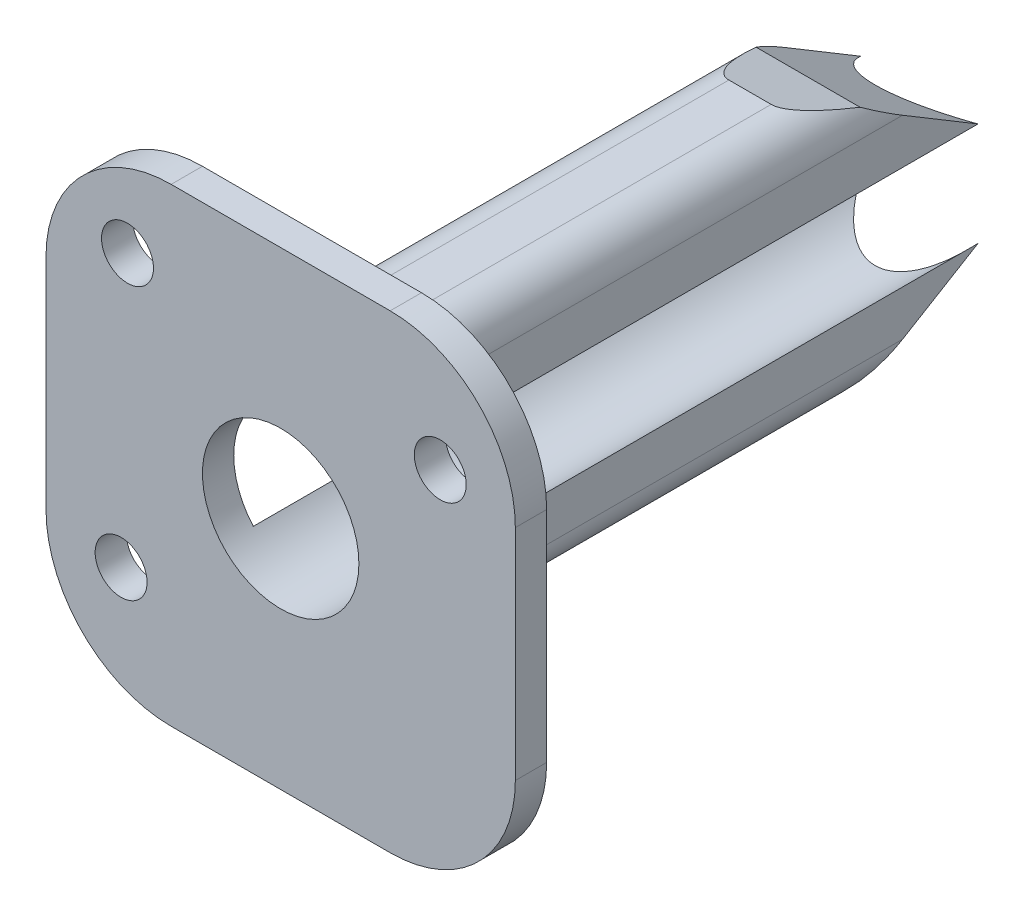
ISO-10303-21;
HEADER;
FILE_DESCRIPTION(('STEP AP214'),'2;1');
FILE_NAME('part.step','',(''),(''),'','','');
FILE_SCHEMA(('AUTOMOTIVE_DESIGN { 1 0 10303 214 1 1 1 1 }'));
ENDSEC;
DATA;
#1=APPLICATION_CONTEXT('core data for automotive mechanical design processes');
#2=APPLICATION_PROTOCOL_DEFINITION('international standard','automotive_design',2000,#1);
#3=PRODUCT_CONTEXT('',#1,'mechanical');
#4=PRODUCT('Part','Part','',(#3));
#5=PRODUCT_RELATED_PRODUCT_CATEGORY('part','',(#4));
#6=PRODUCT_DEFINITION_FORMATION('','',#4);
#7=PRODUCT_DEFINITION_CONTEXT('part definition',#1,'design');
#8=PRODUCT_DEFINITION('design','',#6,#7);
#9=PRODUCT_DEFINITION_SHAPE('','',#8);
#10=(LENGTH_UNIT() NAMED_UNIT(*) SI_UNIT(.MILLI.,.METRE.));
#11=(NAMED_UNIT(*) PLANE_ANGLE_UNIT() SI_UNIT($,.RADIAN.));
#12=(NAMED_UNIT(*) SI_UNIT($,.STERADIAN.) SOLID_ANGLE_UNIT());
#13=UNCERTAINTY_MEASURE_WITH_UNIT(LENGTH_MEASURE(1.E-05),#10,'distance_accuracy_value','');
#14=(GEOMETRIC_REPRESENTATION_CONTEXT(3) GLOBAL_UNCERTAINTY_ASSIGNED_CONTEXT((#13)) GLOBAL_UNIT_ASSIGNED_CONTEXT((#10,
#11,#12)) REPRESENTATION_CONTEXT('',''));
#15=CARTESIAN_POINT('',(0.,0.,0.));
#16=DIRECTION('',(0.,0.,1.));
#17=DIRECTION('',(1.,0.,0.));
#18=AXIS2_PLACEMENT_3D('',#15,#16,#17);
#19=CARTESIAN_POINT('',(0.,0.,0.));
#20=DIRECTION('',(0.,0.,1.));
#21=DIRECTION('',(1.,0.,0.));
#22=AXIS2_PLACEMENT_3D('',#19,#20,#21);
#23=PLANE('',#22);
#24=CARTESIAN_POINT('',(25.5,19.5,0.));
#25=DIRECTION('',(0.,0.,1.));
#26=DIRECTION('',(1.,0.,0.));
#27=AXIS2_PLACEMENT_3D('',#24,#25,#26);
#28=CIRCLE('',#27,4.15);
#29=CARTESIAN_POINT('',(29.65,19.5,0.));
#30=VERTEX_POINT('',#29);
#31=EDGE_CURVE('E213',#30,#30,#28,.T.);
#32=ORIENTED_EDGE('',*,*,#31,.T.);
#33=EDGE_LOOP('',(#32));
#34=FACE_BOUND('',#33,.T.);
#35=CARTESIAN_POINT('',(-24.48,24.48,0.));
#36=DIRECTION('',(0.,0.,1.));
#37=DIRECTION('',(1.,0.,0.));
#38=AXIS2_PLACEMENT_3D('',#35,#36,#37);
#39=CIRCLE('',#38,4.15);
#40=CARTESIAN_POINT('',(-20.33,24.48,0.));
#41=VERTEX_POINT('',#40);
#42=EDGE_CURVE('E444',#41,#41,#39,.T.);
#43=ORIENTED_EDGE('',*,*,#42,.T.);
#44=EDGE_LOOP('',(#43));
#45=FACE_BOUND('',#44,.T.);
#46=CARTESIAN_POINT('',(-25.5,-19.5,0.));
#47=DIRECTION('',(0.,0.,1.));
#48=DIRECTION('',(1.,0.,0.));
#49=AXIS2_PLACEMENT_3D('',#46,#47,#48);
#50=CIRCLE('',#49,4.15);
#51=CARTESIAN_POINT('',(-21.35,-19.5,0.));
#52=VERTEX_POINT('',#51);
#53=EDGE_CURVE('E448',#52,#52,#50,.T.);
#54=ORIENTED_EDGE('',*,*,#53,.T.);
#55=EDGE_LOOP('',(#54));
#56=FACE_BOUND('',#55,.T.);
#57=CARTESIAN_POINT('',(0.,0.,0.));
#58=DIRECTION('',(0.,0.,1.));
#59=DIRECTION('',(1.,0.,0.));
#60=AXIS2_PLACEMENT_3D('',#57,#58,#59);
#61=CIRCLE('',#60,12.5);
#62=CARTESIAN_POINT('',(-9.375,8.26797284707684,0.));
#63=VERTEX_POINT('',#62);
#64=CARTESIAN_POINT('',(-9.375,-8.26797284707685,0.));
#65=VERTEX_POINT('',#64);
#66=EDGE_CURVE('E212',#63,#65,#61,.T.);
#67=ORIENTED_EDGE('',*,*,#66,.T.);
#68=DIRECTION('',(0.,1.,0.));
#69=VECTOR('',#68,1.);
#70=CARTESIAN_POINT('',(-9.375,0.,0.));
#71=LINE('',#70,#69);
#72=CARTESIAN_POINT('',(-9.375,-15.5,0.));
#73=VERTEX_POINT('',#72);
#74=EDGE_CURVE('E252',#73,#65,#71,.T.);
#75=ORIENTED_EDGE('',*,*,#74,.F.);
#76=CARTESIAN_POINT('',(-3.375,-15.5,0.));
#77=DIRECTION('',(0.,0.,1.));
#78=DIRECTION('',(1.,0.,0.));
#79=AXIS2_PLACEMENT_3D('',#76,#77,#78);
#80=CIRCLE('',#79,6.);
#81=CARTESIAN_POINT('',(-3.375,-21.5,0.));
#82=VERTEX_POINT('',#81);
#83=EDGE_CURVE('E376',#73,#82,#80,.T.);
#84=ORIENTED_EDGE('',*,*,#83,.T.);
#85=DIRECTION('',(-1.,0.,0.));
#86=VECTOR('',#85,1.);
#87=CARTESIAN_POINT('',(0.,-21.5,0.));
#88=LINE('',#87,#86);
#89=CARTESIAN_POINT('',(3.375,-21.5,0.));
#90=VERTEX_POINT('',#89);
#91=EDGE_CURVE('E431',#90,#82,#88,.T.);
#92=ORIENTED_EDGE('',*,*,#91,.F.);
#93=CARTESIAN_POINT('',(3.375,-15.5,0.));
#94=DIRECTION('',(0.,0.,1.));
#95=DIRECTION('',(1.,0.,0.));
#96=AXIS2_PLACEMENT_3D('',#93,#94,#95);
#97=CIRCLE('',#96,6.);
#98=CARTESIAN_POINT('',(9.375,-15.5,0.));
#99=VERTEX_POINT('',#98);
#100=EDGE_CURVE('E379',#90,#99,#97,.T.);
#101=ORIENTED_EDGE('',*,*,#100,.T.);
#102=DIRECTION('',(0.,1.,0.));
#103=VECTOR('',#102,1.);
#104=CARTESIAN_POINT('',(9.375,0.,0.));
#105=LINE('',#104,#103);
#106=CARTESIAN_POINT('',(9.375,-8.26797284707684,0.));
#107=VERTEX_POINT('',#106);
#108=EDGE_CURVE('E207',#99,#107,#105,.T.);
#109=ORIENTED_EDGE('',*,*,#108,.T.);
#110=CARTESIAN_POINT('',(9.375,8.26797284707684,0.));
#111=VERTEX_POINT('',#110);
#112=EDGE_CURVE('E200',#107,#111,#61,.T.);
#113=ORIENTED_EDGE('',*,*,#112,.T.);
#114=DIRECTION('',(0.,1.,0.));
#115=VECTOR('',#114,1.);
#116=CARTESIAN_POINT('',(9.375,0.,0.));
#117=LINE('',#116,#115);
#118=CARTESIAN_POINT('',(9.375,15.5,0.));
#119=VERTEX_POINT('',#118);
#120=EDGE_CURVE('E205',#111,#119,#117,.T.);
#121=ORIENTED_EDGE('',*,*,#120,.T.);
#122=CARTESIAN_POINT('',(3.375,15.5,0.));
#123=DIRECTION('',(0.,0.,1.));
#124=DIRECTION('',(1.,0.,0.));
#125=AXIS2_PLACEMENT_3D('',#122,#123,#124);
#126=CIRCLE('',#125,6.);
#127=CARTESIAN_POINT('',(3.375,21.5,0.));
#128=VERTEX_POINT('',#127);
#129=EDGE_CURVE('E370',#119,#128,#126,.T.);
#130=ORIENTED_EDGE('',*,*,#129,.T.);
#131=DIRECTION('',(-1.,0.,0.));
#132=VECTOR('',#131,1.);
#133=CARTESIAN_POINT('',(0.,21.5,0.));
#134=LINE('',#133,#132);
#135=CARTESIAN_POINT('',(-3.375,21.5,0.));
#136=VERTEX_POINT('',#135);
#137=EDGE_CURVE('E234',#128,#136,#134,.T.);
#138=ORIENTED_EDGE('',*,*,#137,.T.);
#139=CARTESIAN_POINT('',(-3.375,15.5,0.));
#140=DIRECTION('',(0.,0.,1.));
#141=DIRECTION('',(1.,0.,0.));
#142=AXIS2_PLACEMENT_3D('',#139,#140,#141);
#143=CIRCLE('',#142,6.);
#144=CARTESIAN_POINT('',(-9.375,15.5,0.));
#145=VERTEX_POINT('',#144);
#146=EDGE_CURVE('E373',#136,#145,#143,.T.);
#147=ORIENTED_EDGE('',*,*,#146,.T.);
#148=DIRECTION('',(0.,1.,0.));
#149=VECTOR('',#148,1.);
#150=CARTESIAN_POINT('',(-9.375,0.,0.));
#151=LINE('',#150,#149);
#152=EDGE_CURVE('E227',#63,#145,#151,.T.);
#153=ORIENTED_EDGE('',*,*,#152,.F.);
#154=EDGE_LOOP('',(#67,#75,#84,#92,#101,#109,#113,#121,#130,#138,#147,#153));
#155=FACE_BOUND('',#154,.T.);
#156=DIRECTION('',(0.,1.,0.));
#157=VECTOR('',#156,1.);
#158=CARTESIAN_POINT('',(-37.5,0.,0.));
#159=LINE('',#158,#157);
#160=CARTESIAN_POINT('',(-37.5,-17.5,0.));
#161=VERTEX_POINT('',#160);
#162=CARTESIAN_POINT('',(-37.5,17.5,0.));
#163=VERTEX_POINT('',#162);
#164=EDGE_CURVE('E280',#161,#163,#159,.T.);
#165=ORIENTED_EDGE('',*,*,#164,.T.);
#166=CARTESIAN_POINT('',(-17.5,17.5,0.));
#167=DIRECTION('',(0.,0.,1.));
#168=DIRECTION('',(1.,0.,0.));
#169=AXIS2_PLACEMENT_3D('',#166,#167,#168);
#170=CIRCLE('',#169,20.);
#171=CARTESIAN_POINT('',(-17.5,37.5,0.));
#172=VERTEX_POINT('',#171);
#173=EDGE_CURVE('E398',#163,#172,#170,.F.);
#174=ORIENTED_EDGE('',*,*,#173,.T.);
#175=DIRECTION('',(-1.,0.,0.));
#176=VECTOR('',#175,1.);
#177=CARTESIAN_POINT('',(0.,37.5,0.));
#178=LINE('',#177,#176);
#179=CARTESIAN_POINT('',(17.5,37.5,0.));
#180=VERTEX_POINT('',#179);
#181=EDGE_CURVE('E275',#180,#172,#178,.T.);
#182=ORIENTED_EDGE('',*,*,#181,.F.);
#183=CARTESIAN_POINT('',(17.5,17.5,0.));
#184=DIRECTION('',(0.,0.,1.));
#185=DIRECTION('',(1.,0.,0.));
#186=AXIS2_PLACEMENT_3D('',#183,#184,#185);
#187=CIRCLE('',#186,20.);
#188=CARTESIAN_POINT('',(37.5,17.5,0.));
#189=VERTEX_POINT('',#188);
#190=EDGE_CURVE('E395',#180,#189,#187,.F.);
#191=ORIENTED_EDGE('',*,*,#190,.T.);
#192=DIRECTION('',(0.,1.,0.));
#193=VECTOR('',#192,1.);
#194=CARTESIAN_POINT('',(37.5,0.,0.));
#195=LINE('',#194,#193);
#196=CARTESIAN_POINT('',(37.5,-17.5,0.));
#197=VERTEX_POINT('',#196);
#198=EDGE_CURVE('E271',#197,#189,#195,.T.);
#199=ORIENTED_EDGE('',*,*,#198,.F.);
#200=CARTESIAN_POINT('',(17.5,-17.5,0.));
#201=DIRECTION('',(0.,0.,1.));
#202=DIRECTION('',(1.,0.,0.));
#203=AXIS2_PLACEMENT_3D('',#200,#201,#202);
#204=CIRCLE('',#203,20.);
#205=CARTESIAN_POINT('',(17.5,-37.5,0.));
#206=VERTEX_POINT('',#205);
#207=EDGE_CURVE('E389',#197,#206,#204,.F.);
#208=ORIENTED_EDGE('',*,*,#207,.T.);
#209=DIRECTION('',(-1.,0.,0.));
#210=VECTOR('',#209,1.);
#211=CARTESIAN_POINT('',(0.,-37.5,0.));
#212=LINE('',#211,#210);
#213=CARTESIAN_POINT('',(-17.5,-37.5,0.));
#214=VERTEX_POINT('',#213);
#215=EDGE_CURVE('E259',#206,#214,#212,.T.);
#216=ORIENTED_EDGE('',*,*,#215,.T.);
#217=CARTESIAN_POINT('',(-17.5,-17.5,0.));
#218=DIRECTION('',(0.,0.,1.));
#219=DIRECTION('',(1.,0.,0.));
#220=AXIS2_PLACEMENT_3D('',#217,#218,#219);
#221=CIRCLE('',#220,20.);
#222=EDGE_CURVE('E392',#214,#161,#221,.F.);
#223=ORIENTED_EDGE('',*,*,#222,.T.);
#224=EDGE_LOOP('',(#165,#174,#182,#191,#199,#208,#216,#223));
#225=FACE_BOUND('',#224,.T.);
#226=ADVANCED_FACE('F49',(#34,#45,#56,#155,#225),#23,.F.);
#227=CARTESIAN_POINT('',(37.5,0.,5.));
#228=DIRECTION('',(-1.,0.,0.));
#229=DIRECTION('',(0.,-1.,0.));
#230=AXIS2_PLACEMENT_3D('',#227,#228,#229);
#231=PLANE('',#230);
#232=ORIENTED_EDGE('',*,*,#198,.T.);
#233=DIRECTION('',(0.,0.,-1.));
#234=VECTOR('',#233,1.);
#235=CARTESIAN_POINT('',(37.5,17.5,5.));
#236=LINE('',#235,#234);
#237=CARTESIAN_POINT('',(37.5,17.5,5.));
#238=VERTEX_POINT('',#237);
#239=EDGE_CURVE('E423',#189,#238,#236,.F.);
#240=ORIENTED_EDGE('',*,*,#239,.T.);
#241=DIRECTION('',(0.,1.,0.));
#242=VECTOR('',#241,1.);
#243=CARTESIAN_POINT('',(37.5,0.,5.));
#244=LINE('',#243,#242);
#245=CARTESIAN_POINT('',(37.5,-17.5,5.));
#246=VERTEX_POINT('',#245);
#247=EDGE_CURVE('E254',#246,#238,#244,.T.);
#248=ORIENTED_EDGE('',*,*,#247,.F.);
#249=DIRECTION('',(0.,0.,-1.));
#250=VECTOR('',#249,1.);
#251=CARTESIAN_POINT('',(37.5,-17.5,0.));
#252=LINE('',#251,#250);
#253=EDGE_CURVE('E419',#246,#197,#252,.T.);
#254=ORIENTED_EDGE('',*,*,#253,.T.);
#255=EDGE_LOOP('',(#232,#240,#248,#254));
#256=FACE_BOUND('',#255,.T.);
#257=ADVANCED_FACE('F502',(#256),#231,.F.);
#258=CARTESIAN_POINT('',(0.,37.5,5.));
#259=DIRECTION('',(0.,-1.,0.));
#260=DIRECTION('',(0.,0.,-1.));
#261=AXIS2_PLACEMENT_3D('',#258,#259,#260);
#262=PLANE('',#261);
#263=ORIENTED_EDGE('',*,*,#181,.T.);
#264=DIRECTION('',(0.,0.,-1.));
#265=VECTOR('',#264,1.);
#266=CARTESIAN_POINT('',(-17.5,37.5,5.));
#267=LINE('',#266,#265);
#268=CARTESIAN_POINT('',(-17.5,37.5,5.));
#269=VERTEX_POINT('',#268);
#270=EDGE_CURVE('E405',#172,#269,#267,.F.);
#271=ORIENTED_EDGE('',*,*,#270,.T.);
#272=DIRECTION('',(-1.,0.,0.));
#273=VECTOR('',#272,1.);
#274=CARTESIAN_POINT('',(0.,37.5,5.));
#275=LINE('',#274,#273);
#276=CARTESIAN_POINT('',(17.5,37.5,5.));
#277=VERTEX_POINT('',#276);
#278=EDGE_CURVE('E258',#277,#269,#275,.T.);
#279=ORIENTED_EDGE('',*,*,#278,.F.);
#280=DIRECTION('',(0.,0.,-1.));
#281=VECTOR('',#280,1.);
#282=CARTESIAN_POINT('',(17.5,37.5,5.));
#283=LINE('',#282,#281);
#284=EDGE_CURVE('E401',#277,#180,#283,.T.);
#285=ORIENTED_EDGE('',*,*,#284,.T.);
#286=EDGE_LOOP('',(#263,#271,#279,#285));
#287=FACE_BOUND('',#286,.T.);
#288=ADVANCED_FACE('F506',(#287),#262,.F.);
#289=CARTESIAN_POINT('',(-37.5,0.,5.));
#290=DIRECTION('',(-1.,0.,0.));
#291=DIRECTION('',(0.,-1.,0.));
#292=AXIS2_PLACEMENT_3D('',#289,#290,#291);
#293=PLANE('',#292);
#294=DIRECTION('',(0.,1.,0.));
#295=VECTOR('',#294,1.);
#296=CARTESIAN_POINT('',(-37.5,0.,5.));
#297=LINE('',#296,#295);
#298=CARTESIAN_POINT('',(-37.5,-17.5,5.));
#299=VERTEX_POINT('',#298);
#300=CARTESIAN_POINT('',(-37.5,17.5,5.));
#301=VERTEX_POINT('',#300);
#302=EDGE_CURVE('E263',#299,#301,#297,.T.);
#303=ORIENTED_EDGE('',*,*,#302,.T.);
#304=DIRECTION('',(0.,0.,-1.));
#305=VECTOR('',#304,1.);
#306=CARTESIAN_POINT('',(-37.5,17.5,0.));
#307=LINE('',#306,#305);
#308=EDGE_CURVE('E385',#301,#163,#307,.T.);
#309=ORIENTED_EDGE('',*,*,#308,.T.);
#310=ORIENTED_EDGE('',*,*,#164,.F.);
#311=DIRECTION('',(0.,0.,-1.));
#312=VECTOR('',#311,1.);
#313=CARTESIAN_POINT('',(-37.5,-17.5,5.));
#314=LINE('',#313,#312);
#315=EDGE_CURVE('E382',#161,#299,#314,.F.);
#316=ORIENTED_EDGE('',*,*,#315,.T.);
#317=EDGE_LOOP('',(#303,#309,#310,#316));
#318=FACE_BOUND('',#317,.T.);
#319=ADVANCED_FACE('F490',(#318),#293,.T.);
#320=CARTESIAN_POINT('',(0.,-37.5,5.));
#321=DIRECTION('',(0.,-1.,0.));
#322=DIRECTION('',(1.,0.,0.));
#323=AXIS2_PLACEMENT_3D('',#320,#321,#322);
#324=PLANE('',#323);
#325=DIRECTION('',(-1.,0.,0.));
#326=VECTOR('',#325,1.);
#327=CARTESIAN_POINT('',(0.,-37.5,5.));
#328=LINE('',#327,#326);
#329=CARTESIAN_POINT('',(17.5,-37.5,5.));
#330=VERTEX_POINT('',#329);
#331=CARTESIAN_POINT('',(-17.5,-37.5,5.));
#332=VERTEX_POINT('',#331);
#333=EDGE_CURVE('E267',#330,#332,#328,.T.);
#334=ORIENTED_EDGE('',*,*,#333,.T.);
#335=DIRECTION('',(0.,0.,-1.));
#336=VECTOR('',#335,1.);
#337=CARTESIAN_POINT('',(-17.5,-37.5,5.));
#338=LINE('',#337,#336);
#339=EDGE_CURVE('E11',#332,#214,#338,.T.);
#340=ORIENTED_EDGE('',*,*,#339,.T.);
#341=ORIENTED_EDGE('',*,*,#215,.F.);
#342=DIRECTION('',(0.,0.,-1.));
#343=VECTOR('',#342,1.);
#344=CARTESIAN_POINT('',(17.5,-37.5,5.));
#345=LINE('',#344,#343);
#346=EDGE_CURVE('E58',#206,#330,#345,.F.);
#347=ORIENTED_EDGE('',*,*,#346,.T.);
#348=EDGE_LOOP('',(#334,#340,#341,#347));
#349=FACE_BOUND('',#348,.T.);
#350=ADVANCED_FACE('F472',(#349),#324,.T.);
#351=CARTESIAN_POINT('',(0.,0.,5.));
#352=DIRECTION('',(0.,0.,1.));
#353=DIRECTION('',(1.,0.,0.));
#354=AXIS2_PLACEMENT_3D('',#351,#352,#353);
#355=PLANE('',#354);
#356=CARTESIAN_POINT('',(25.5,19.5,5.));
#357=DIRECTION('',(0.,0.,1.));
#358=DIRECTION('',(1.,0.,0.));
#359=AXIS2_PLACEMENT_3D('',#356,#357,#358);
#360=CIRCLE('',#359,4.15);
#361=CARTESIAN_POINT('',(29.65,19.5,5.));
#362=VERTEX_POINT('',#361);
#363=EDGE_CURVE('E452',#362,#362,#360,.T.);
#364=ORIENTED_EDGE('',*,*,#363,.F.);
#365=EDGE_LOOP('',(#364));
#366=FACE_BOUND('',#365,.T.);
#367=CARTESIAN_POINT('',(-24.48,24.48,5.));
#368=DIRECTION('',(0.,0.,1.));
#369=DIRECTION('',(1.,0.,0.));
#370=AXIS2_PLACEMENT_3D('',#367,#368,#369);
#371=CIRCLE('',#370,4.15);
#372=CARTESIAN_POINT('',(-20.33,24.48,5.));
#373=VERTEX_POINT('',#372);
#374=EDGE_CURVE('E457',#373,#373,#371,.T.);
#375=ORIENTED_EDGE('',*,*,#374,.F.);
#376=EDGE_LOOP('',(#375));
#377=FACE_BOUND('',#376,.T.);
#378=CARTESIAN_POINT('',(-25.5,-19.5,5.));
#379=DIRECTION('',(0.,0.,1.));
#380=DIRECTION('',(1.,0.,0.));
#381=AXIS2_PLACEMENT_3D('',#378,#379,#380);
#382=CIRCLE('',#381,4.15);
#383=CARTESIAN_POINT('',(-21.35,-19.5,5.));
#384=VERTEX_POINT('',#383);
#385=EDGE_CURVE('E453',#384,#384,#382,.T.);
#386=ORIENTED_EDGE('',*,*,#385,.F.);
#387=EDGE_LOOP('',(#386));
#388=FACE_BOUND('',#387,.T.);
#389=CARTESIAN_POINT('',(0.,0.,5.));
#390=DIRECTION('',(0.,0.,1.));
#391=DIRECTION('',(1.,0.,0.));
#392=AXIS2_PLACEMENT_3D('',#389,#390,#391);
#393=CIRCLE('',#392,12.5);
#394=CARTESIAN_POINT('',(12.5,0.,5.));
#395=VERTEX_POINT('',#394);
#396=EDGE_CURVE('E235',#395,#395,#393,.T.);
#397=ORIENTED_EDGE('',*,*,#396,.F.);
#398=EDGE_LOOP('',(#397));
#399=FACE_BOUND('',#398,.T.);
#400=ORIENTED_EDGE('',*,*,#278,.T.);
#401=CARTESIAN_POINT('',(-17.5,17.5,5.));
#402=DIRECTION('',(0.,0.,1.));
#403=DIRECTION('',(1.,0.,0.));
#404=AXIS2_PLACEMENT_3D('',#401,#402,#403);
#405=CIRCLE('',#404,20.);
#406=EDGE_CURVE('E416',#269,#301,#405,.T.);
#407=ORIENTED_EDGE('',*,*,#406,.T.);
#408=ORIENTED_EDGE('',*,*,#302,.F.);
#409=CARTESIAN_POINT('',(-17.5,-17.5,5.));
#410=DIRECTION('',(0.,0.,1.));
#411=DIRECTION('',(1.,0.,0.));
#412=AXIS2_PLACEMENT_3D('',#409,#410,#411);
#413=CIRCLE('',#412,20.);
#414=EDGE_CURVE('E65',#299,#332,#413,.T.);
#415=ORIENTED_EDGE('',*,*,#414,.T.);
#416=ORIENTED_EDGE('',*,*,#333,.F.);
#417=CARTESIAN_POINT('',(17.5,-17.5,5.));
#418=DIRECTION('',(0.,0.,1.));
#419=DIRECTION('',(1.,0.,0.));
#420=AXIS2_PLACEMENT_3D('',#417,#418,#419);
#421=CIRCLE('',#420,20.);
#422=EDGE_CURVE('E408',#330,#246,#421,.T.);
#423=ORIENTED_EDGE('',*,*,#422,.T.);
#424=ORIENTED_EDGE('',*,*,#247,.T.);
#425=CARTESIAN_POINT('',(17.5,17.5,5.));
#426=DIRECTION('',(0.,0.,1.));
#427=DIRECTION('',(1.,0.,0.));
#428=AXIS2_PLACEMENT_3D('',#425,#426,#427);
#429=CIRCLE('',#428,20.);
#430=EDGE_CURVE('E413',#238,#277,#429,.T.);
#431=ORIENTED_EDGE('',*,*,#430,.T.);
#432=EDGE_LOOP('',(#400,#407,#408,#415,#416,#423,#424,#431));
#433=FACE_BOUND('',#432,.T.);
#434=ADVANCED_FACE('F468',(#366,#377,#388,#399,#433),#355,.T.);
#435=CARTESIAN_POINT('',(-9.375,0.,-100.));
#436=DIRECTION('',(1.,0.,0.));
#437=DIRECTION('',(0.,1.,0.));
#438=AXIS2_PLACEMENT_3D('',#435,#436,#437);
#439=PLANE('',#438);
#440=ORIENTED_EDGE('',*,*,#152,.T.);
#441=DIRECTION('',(0.,0.,1.));
#442=VECTOR('',#441,1.);
#443=CARTESIAN_POINT('',(-9.375,15.5,-69.9999999999998));
#444=LINE('',#443,#442);
#445=CARTESIAN_POINT('',(-9.375,15.5,-84.9999999999998));
#446=VERTEX_POINT('',#445);
#447=EDGE_CURVE('E341',#145,#446,#444,.F.);
#448=ORIENTED_EDGE('',*,*,#447,.T.);
#449=DIRECTION('',(0.,-0.514495755427529,-0.857492925712543));
#450=VECTOR('',#449,1.);
#451=CARTESIAN_POINT('',(-9.37500000000001,21.5,-74.9999999999999));
#452=LINE('',#451,#450);
#453=CARTESIAN_POINT('',(-9.375,8.26797284707684,-97.053378588205));
#454=VERTEX_POINT('',#453);
#455=EDGE_CURVE('E270',#446,#454,#452,.T.);
#456=ORIENTED_EDGE('',*,*,#455,.T.);
#457=DIRECTION('',(0.,0.,1.));
#458=VECTOR('',#457,1.);
#459=CARTESIAN_POINT('',(-9.375,8.26797284707684,-100.));
#460=LINE('',#459,#458);
#461=EDGE_CURVE('E226',#454,#63,#460,.T.);
#462=ORIENTED_EDGE('',*,*,#461,.T.);
#463=EDGE_LOOP('',(#440,#448,#456,#462));
#464=FACE_BOUND('',#463,.T.);
#465=ADVANCED_FACE('F471',(#464),#439,.F.);
#466=CARTESIAN_POINT('',(0.,21.5,-100.));
#467=DIRECTION('',(0.,1.,0.));
#468=DIRECTION('',(0.,0.,1.));
#469=AXIS2_PLACEMENT_3D('',#466,#467,#468);
#470=PLANE('',#469);
#471=ORIENTED_EDGE('',*,*,#137,.F.);
#472=DIRECTION('',(0.,0.,1.));
#473=VECTOR('',#472,1.);
#474=CARTESIAN_POINT('',(3.375,21.5,-100.));
#475=LINE('',#474,#473);
#476=CARTESIAN_POINT('',(3.375,21.5,-69.9999999999998));
#477=VERTEX_POINT('',#476);
#478=EDGE_CURVE('E326',#128,#477,#475,.F.);
#479=ORIENTED_EDGE('',*,*,#478,.T.);
#480=DIRECTION('',(-1.,0.,0.));
#481=VECTOR('',#480,1.);
#482=CARTESIAN_POINT('',(0.,21.5,-69.9999999999998));
#483=LINE('',#482,#481);
#484=CARTESIAN_POINT('',(-3.375,21.5,-69.9999999999998));
#485=VERTEX_POINT('',#484);
#486=EDGE_CURVE('E304',#477,#485,#483,.T.);
#487=ORIENTED_EDGE('',*,*,#486,.T.);
#488=DIRECTION('',(0.,0.,1.));
#489=VECTOR('',#488,1.);
#490=CARTESIAN_POINT('',(-3.375,21.5,0.));
#491=LINE('',#490,#489);
#492=EDGE_CURVE('E322',#485,#136,#491,.T.);
#493=ORIENTED_EDGE('',*,*,#492,.T.);
#494=EDGE_LOOP('',(#471,#479,#487,#493));
#495=FACE_BOUND('',#494,.T.);
#496=ADVANCED_FACE('F606',(#495),#470,.T.);
#497=CARTESIAN_POINT('',(9.375,0.,-100.));
#498=DIRECTION('',(1.,0.,0.));
#499=DIRECTION('',(0.,1.,0.));
#500=AXIS2_PLACEMENT_3D('',#497,#498,#499);
#501=PLANE('',#500);
#502=DIRECTION('',(0.,0.514495755427529,0.857492925712543));
#503=VECTOR('',#502,1.);
#504=CARTESIAN_POINT('',(9.375,4.77941176470572,-102.867647058823));
#505=LINE('',#504,#503);
#506=CARTESIAN_POINT('',(9.375,8.26797284707684,-97.053378588205));
#507=VERTEX_POINT('',#506);
#508=CARTESIAN_POINT('',(9.375,15.5,-84.9999999999998));
#509=VERTEX_POINT('',#508);
#510=EDGE_CURVE('E291',#507,#509,#505,.T.);
#511=ORIENTED_EDGE('',*,*,#510,.T.);
#512=DIRECTION('',(0.,0.,1.));
#513=VECTOR('',#512,1.);
#514=CARTESIAN_POINT('',(9.375,15.5,-100.));
#515=LINE('',#514,#513);
#516=EDGE_CURVE('E232',#509,#119,#515,.T.);
#517=ORIENTED_EDGE('',*,*,#516,.T.);
#518=ORIENTED_EDGE('',*,*,#120,.F.);
#519=DIRECTION('',(0.,0.,1.));
#520=VECTOR('',#519,1.);
#521=CARTESIAN_POINT('',(9.375,8.26797284707684,-100.));
#522=LINE('',#521,#520);
#523=EDGE_CURVE('E216',#507,#111,#522,.T.);
#524=ORIENTED_EDGE('',*,*,#523,.F.);
#525=EDGE_LOOP('',(#511,#517,#518,#524));
#526=FACE_BOUND('',#525,.T.);
#527=ADVANCED_FACE('F230',(#526),#501,.T.);
#528=CARTESIAN_POINT('',(0.,0.,-100.));
#529=DIRECTION('',(0.,0.,1.));
#530=DIRECTION('',(1.,0.,0.));
#531=AXIS2_PLACEMENT_3D('',#528,#529,#530);
#532=CYLINDRICAL_SURFACE('',#531,12.5);
#533=DIRECTION('',(0.,0.,1.));
#534=VECTOR('',#533,1.);
#535=CARTESIAN_POINT('',(9.375,-8.26797284707684,-100.));
#536=LINE('',#535,#534);
#537=CARTESIAN_POINT('',(9.375,-8.26797284707684,-97.053378588205));
#538=VERTEX_POINT('',#537);
#539=EDGE_CURVE('E276',#538,#107,#536,.T.);
#540=ORIENTED_EDGE('',*,*,#539,.F.);
#541=CARTESIAN_POINT('',(0.,0.,-110.833333333333));
#542=DIRECTION('',(0.,0.857492925712542,0.514495755427529));
#543=DIRECTION('',(0.,-0.514495755427529,0.857492925712543));
#544=AXIS2_PLACEMENT_3D('',#541,#542,#543);
#545=ELLIPSE('',#544,24.2956328951886,12.5);
#546=CARTESIAN_POINT('',(-9.375,-8.26797284707685,-97.053378588205));
#547=VERTEX_POINT('',#546);
#548=EDGE_CURVE('E294',#538,#547,#545,.F.);
#549=ORIENTED_EDGE('',*,*,#548,.T.);
#550=DIRECTION('',(0.,0.,1.));
#551=VECTOR('',#550,1.);
#552=CARTESIAN_POINT('',(-9.375,-8.26797284707685,-100.));
#553=LINE('',#552,#551);
#554=EDGE_CURVE('E244',#547,#65,#553,.T.);
#555=ORIENTED_EDGE('',*,*,#554,.T.);
#556=ORIENTED_EDGE('',*,*,#66,.F.);
#557=ORIENTED_EDGE('',*,*,#461,.F.);
#558=CARTESIAN_POINT('',(0.,0.,-110.833333333333));
#559=DIRECTION('',(0.,0.857492925712542,-0.514495755427529));
#560=DIRECTION('',(0.,0.514495755427529,0.857492925712543));
#561=AXIS2_PLACEMENT_3D('',#558,#559,#560);
#562=ELLIPSE('',#561,24.2956328951886,12.5);
#563=EDGE_CURVE('E221',#454,#507,#562,.T.);
#564=ORIENTED_EDGE('',*,*,#563,.T.);
#565=ORIENTED_EDGE('',*,*,#523,.T.);
#566=ORIENTED_EDGE('',*,*,#112,.F.);
#567=EDGE_LOOP('',(#540,#549,#555,#556,#557,#564,#565,#566));
#568=FACE_BOUND('',#567,.T.);
#569=ORIENTED_EDGE('',*,*,#396,.T.);
#570=EDGE_LOOP('',(#569));
#571=FACE_BOUND('',#570,.T.);
#572=ADVANCED_FACE('F217',(#568,#571),#532,.F.);
#573=CARTESIAN_POINT('',(9.375,0.,-100.));
#574=DIRECTION('',(1.,0.,0.));
#575=DIRECTION('',(0.,1.,0.));
#576=AXIS2_PLACEMENT_3D('',#573,#574,#575);
#577=PLANE('',#576);
#578=ORIENTED_EDGE('',*,*,#108,.F.);
#579=DIRECTION('',(0.,0.,1.));
#580=VECTOR('',#579,1.);
#581=CARTESIAN_POINT('',(9.375,-15.5,-69.9999999999998));
#582=LINE('',#581,#580);
#583=CARTESIAN_POINT('',(9.375,-15.5,-84.9999999999998));
#584=VERTEX_POINT('',#583);
#585=EDGE_CURVE('E367',#99,#584,#582,.F.);
#586=ORIENTED_EDGE('',*,*,#585,.T.);
#587=DIRECTION('',(0.,-0.514495755427529,0.857492925712543));
#588=VECTOR('',#587,1.);
#589=CARTESIAN_POINT('',(9.375,-4.77941176470574,-102.867647058823));
#590=LINE('',#589,#588);
#591=EDGE_CURVE('E301',#584,#538,#590,.F.);
#592=ORIENTED_EDGE('',*,*,#591,.T.);
#593=ORIENTED_EDGE('',*,*,#539,.T.);
#594=EDGE_LOOP('',(#578,#586,#592,#593));
#595=FACE_BOUND('',#594,.T.);
#596=ADVANCED_FACE('F590',(#595),#577,.T.);
#597=CARTESIAN_POINT('',(0.,-21.5,-100.));
#598=DIRECTION('',(0.,1.,0.));
#599=DIRECTION('',(-1.,0.,0.));
#600=AXIS2_PLACEMENT_3D('',#597,#598,#599);
#601=PLANE('',#600);
#602=ORIENTED_EDGE('',*,*,#91,.T.);
#603=DIRECTION('',(0.,0.,1.));
#604=VECTOR('',#603,1.);
#605=CARTESIAN_POINT('',(-3.375,-21.5,-100.));
#606=LINE('',#605,#604);
#607=CARTESIAN_POINT('',(-3.375,-21.5,-69.9999999999998));
#608=VERTEX_POINT('',#607);
#609=EDGE_CURVE('E352',#82,#608,#606,.F.);
#610=ORIENTED_EDGE('',*,*,#609,.T.);
#611=DIRECTION('',(1.,0.,0.));
#612=VECTOR('',#611,1.);
#613=CARTESIAN_POINT('',(9.375,-21.5,-69.9999999999998));
#614=LINE('',#613,#612);
#615=CARTESIAN_POINT('',(3.375,-21.5,-69.9999999999998));
#616=VERTEX_POINT('',#615);
#617=EDGE_CURVE('E312',#608,#616,#614,.T.);
#618=ORIENTED_EDGE('',*,*,#617,.T.);
#619=DIRECTION('',(0.,0.,1.));
#620=VECTOR('',#619,1.);
#621=CARTESIAN_POINT('',(3.375,-21.5,0.));
#622=LINE('',#621,#620);
#623=EDGE_CURVE('E348',#616,#90,#622,.T.);
#624=ORIENTED_EDGE('',*,*,#623,.T.);
#625=EDGE_LOOP('',(#602,#610,#618,#624));
#626=FACE_BOUND('',#625,.T.);
#627=ADVANCED_FACE('F593',(#626),#601,.F.);
#628=CARTESIAN_POINT('',(-9.375,0.,-100.));
#629=DIRECTION('',(1.,0.,0.));
#630=DIRECTION('',(0.,1.,0.));
#631=AXIS2_PLACEMENT_3D('',#628,#629,#630);
#632=PLANE('',#631);
#633=DIRECTION('',(0.,0.514495755427529,-0.857492925712543));
#634=VECTOR('',#633,1.);
#635=CARTESIAN_POINT('',(-9.375,-6.49999999999984,-100.));
#636=LINE('',#635,#634);
#637=CARTESIAN_POINT('',(-9.375,-15.5,-84.9999999999998));
#638=VERTEX_POINT('',#637);
#639=EDGE_CURVE('E297',#547,#638,#636,.F.);
#640=ORIENTED_EDGE('',*,*,#639,.T.);
#641=DIRECTION('',(0.,0.,1.));
#642=VECTOR('',#641,1.);
#643=CARTESIAN_POINT('',(-9.375,-15.5,-100.));
#644=LINE('',#643,#642);
#645=EDGE_CURVE('E344',#638,#73,#644,.T.);
#646=ORIENTED_EDGE('',*,*,#645,.T.);
#647=ORIENTED_EDGE('',*,*,#74,.T.);
#648=ORIENTED_EDGE('',*,*,#554,.F.);
#649=EDGE_LOOP('',(#640,#646,#647,#648));
#650=FACE_BOUND('',#649,.T.);
#651=ADVANCED_FACE('F597',(#650),#632,.F.);
#652=CARTESIAN_POINT('',(0.,21.5,-74.9999999999999));
#653=DIRECTION('',(0.,0.857492925712542,-0.514495755427529));
#654=DIRECTION('',(1.,0.,0.));
#655=AXIS2_PLACEMENT_3D('',#652,#653,#654);
#656=PLANE('',#655);
#657=DIRECTION('',(1.,0.,0.));
#658=VECTOR('',#657,1.);
#659=CARTESIAN_POINT('',(0.,18.9275212228623,-79.2874646285627));
#660=LINE('',#659,#658);
#661=CARTESIAN_POINT('',(-8.29964194300748,18.9275212228623,-79.2874646285627));
#662=VERTEX_POINT('',#661);
#663=CARTESIAN_POINT('',(8.29964194300748,18.9275212228623,-79.2874646285627));
#664=VERTEX_POINT('',#663);
#665=EDGE_CURVE('E308',#662,#664,#660,.T.);
#666=ORIENTED_EDGE('',*,*,#665,.T.);
#667=CARTESIAN_POINT('',(3.375,15.5,-84.9999999999998));
#668=DIRECTION('',(0.,0.857492925712542,-0.514495755427529));
#669=DIRECTION('',(0.,0.514495755427529,0.857492925712543));
#670=AXIS2_PLACEMENT_3D('',#667,#668,#669);
#671=ELLIPSE('',#670,11.6619037896905,6.);
#672=EDGE_CURVE('E338',#664,#509,#671,.T.);
#673=ORIENTED_EDGE('',*,*,#672,.T.);
#674=ORIENTED_EDGE('',*,*,#510,.F.);
#675=ORIENTED_EDGE('',*,*,#563,.F.);
#676=ORIENTED_EDGE('',*,*,#455,.F.);
#677=CARTESIAN_POINT('',(-3.375,15.5,-84.9999999999998));
#678=DIRECTION('',(0.,0.857492925712542,-0.514495755427529));
#679=DIRECTION('',(0.,-0.514495755427529,-0.857492925712543));
#680=AXIS2_PLACEMENT_3D('',#677,#678,#679);
#681=ELLIPSE('',#680,11.6619037896905,6.);
#682=EDGE_CURVE('E335',#446,#662,#681,.T.);
#683=ORIENTED_EDGE('',*,*,#682,.T.);
#684=EDGE_LOOP('',(#666,#673,#674,#675,#676,#683));
#685=FACE_BOUND('',#684,.T.);
#686=ADVANCED_FACE('F601',(#685),#656,.T.);
#687=CARTESIAN_POINT('',(0.,-6.49999999999984,-100.));
#688=DIRECTION('',(0.,0.857492925712542,0.514495755427529));
#689=DIRECTION('',(-1.,0.,0.));
#690=AXIS2_PLACEMENT_3D('',#687,#688,#689);
#691=PLANE('',#690);
#692=DIRECTION('',(1.,0.,0.));
#693=VECTOR('',#692,1.);
#694=CARTESIAN_POINT('',(-9.375,-18.9275212228623,-79.2874646285627));
#695=LINE('',#694,#693);
#696=CARTESIAN_POINT('',(8.29964194300748,-18.9275212228623,-79.2874646285627));
#697=VERTEX_POINT('',#696);
#698=CARTESIAN_POINT('',(-8.29964194300748,-18.9275212228623,-79.2874646285627));
#699=VERTEX_POINT('',#698);
#700=EDGE_CURVE('E316',#697,#699,#695,.F.);
#701=ORIENTED_EDGE('',*,*,#700,.T.);
#702=CARTESIAN_POINT('',(-3.375,-15.5,-84.9999999999998));
#703=DIRECTION('',(0.,0.857492925712542,0.514495755427529));
#704=DIRECTION('',(0.,-0.514495755427529,0.857492925712543));
#705=AXIS2_PLACEMENT_3D('',#702,#703,#704);
#706=ELLIPSE('',#705,11.6619037896905,6.);
#707=EDGE_CURVE('E364',#699,#638,#706,.F.);
#708=ORIENTED_EDGE('',*,*,#707,.T.);
#709=ORIENTED_EDGE('',*,*,#639,.F.);
#710=ORIENTED_EDGE('',*,*,#548,.F.);
#711=ORIENTED_EDGE('',*,*,#591,.F.);
#712=CARTESIAN_POINT('',(3.375,-15.5,-84.9999999999998));
#713=DIRECTION('',(0.,0.857492925712542,0.514495755427529));
#714=DIRECTION('',(0.,0.514495755427529,-0.857492925712543));
#715=AXIS2_PLACEMENT_3D('',#712,#713,#714);
#716=ELLIPSE('',#715,11.6619037896905,6.);
#717=EDGE_CURVE('E361',#584,#697,#716,.F.);
#718=ORIENTED_EDGE('',*,*,#717,.T.);
#719=EDGE_LOOP('',(#701,#708,#709,#710,#711,#718));
#720=FACE_BOUND('',#719,.T.);
#721=ADVANCED_FACE('F638',(#720),#691,.F.);
#722=CARTESIAN_POINT('',(0.,21.5,-69.9999999999998));
#723=DIRECTION('',(0.,-0.96371492821076,0.266933581895814));
#724=DIRECTION('',(-1.,0.,0.));
#725=AXIS2_PLACEMENT_3D('',#722,#723,#724);
#726=PLANE('',#725);
#727=ORIENTED_EDGE('',*,*,#486,.F.);
#728=CARTESIAN_POINT('',(3.375,15.5,-91.6619037896902));
#729=DIRECTION('',(0.,-0.96371492821076,0.266933581895814));
#730=DIRECTION('',(0.,0.266933581895814,0.96371492821076));
#731=AXIS2_PLACEMENT_3D('',#728,#729,#730);
#732=ELLIPSE('',#731,22.4775015469648,6.);
#733=EDGE_CURVE('E332',#477,#664,#732,.F.);
#734=ORIENTED_EDGE('',*,*,#733,.T.);
#735=ORIENTED_EDGE('',*,*,#665,.F.);
#736=CARTESIAN_POINT('',(-3.375,15.5,-91.6619037896902));
#737=DIRECTION('',(0.,-0.96371492821076,0.266933581895814));
#738=DIRECTION('',(0.,-0.266933581895814,-0.96371492821076));
#739=AXIS2_PLACEMENT_3D('',#736,#737,#738);
#740=ELLIPSE('',#739,22.4775015469648,6.);
#741=EDGE_CURVE('E329',#662,#485,#740,.F.);
#742=ORIENTED_EDGE('',*,*,#741,.T.);
#743=EDGE_LOOP('',(#727,#734,#735,#742));
#744=FACE_BOUND('',#743,.T.);
#745=ADVANCED_FACE('F647',(#744),#726,.F.);
#746=CARTESIAN_POINT('',(0.,-21.5,-69.9999999999998));
#747=DIRECTION('',(0.,0.96371492821076,0.266933581895814));
#748=DIRECTION('',(1.,0.,0.));
#749=AXIS2_PLACEMENT_3D('',#746,#747,#748);
#750=PLANE('',#749);
#751=ORIENTED_EDGE('',*,*,#617,.F.);
#752=CARTESIAN_POINT('',(-3.375,-15.5,-91.6619037896902));
#753=DIRECTION('',(0.,0.96371492821076,0.266933581895814));
#754=DIRECTION('',(0.,-0.266933581895814,0.96371492821076));
#755=AXIS2_PLACEMENT_3D('',#752,#753,#754);
#756=ELLIPSE('',#755,22.4775015469648,6.);
#757=EDGE_CURVE('E358',#608,#699,#756,.F.);
#758=ORIENTED_EDGE('',*,*,#757,.T.);
#759=ORIENTED_EDGE('',*,*,#700,.F.);
#760=CARTESIAN_POINT('',(3.375,-15.5,-91.6619037896902));
#761=DIRECTION('',(0.,0.96371492821076,0.266933581895814));
#762=DIRECTION('',(0.,0.266933581895814,-0.96371492821076));
#763=AXIS2_PLACEMENT_3D('',#760,#761,#762);
#764=ELLIPSE('',#763,22.4775015469648,6.);
#765=EDGE_CURVE('E355',#697,#616,#764,.F.);
#766=ORIENTED_EDGE('',*,*,#765,.T.);
#767=EDGE_LOOP('',(#751,#758,#759,#766));
#768=FACE_BOUND('',#767,.T.);
#769=ADVANCED_FACE('F657',(#768),#750,.F.);
#770=CARTESIAN_POINT('',(3.375,15.5,-100.));
#771=DIRECTION('',(0.,0.,1.));
#772=DIRECTION('',(1.,0.,0.));
#773=AXIS2_PLACEMENT_3D('',#770,#771,#772);
#774=CYLINDRICAL_SURFACE('',#773,6.);
#775=ORIENTED_EDGE('',*,*,#733,.F.);
#776=ORIENTED_EDGE('',*,*,#478,.F.);
#777=ORIENTED_EDGE('',*,*,#129,.F.);
#778=ORIENTED_EDGE('',*,*,#516,.F.);
#779=ORIENTED_EDGE('',*,*,#672,.F.);
#780=EDGE_LOOP('',(#775,#776,#777,#778,#779));
#781=FACE_BOUND('',#780,.T.);
#782=ADVANCED_FACE('F667',(#781),#774,.T.);
#783=CARTESIAN_POINT('',(-3.375,15.5,-100.));
#784=DIRECTION('',(0.,0.,-1.));
#785=DIRECTION('',(-1.,0.,0.));
#786=AXIS2_PLACEMENT_3D('',#783,#784,#785);
#787=CYLINDRICAL_SURFACE('',#786,6.);
#788=ORIENTED_EDGE('',*,*,#682,.F.);
#789=ORIENTED_EDGE('',*,*,#447,.F.);
#790=ORIENTED_EDGE('',*,*,#146,.F.);
#791=ORIENTED_EDGE('',*,*,#492,.F.);
#792=ORIENTED_EDGE('',*,*,#741,.F.);
#793=EDGE_LOOP('',(#788,#789,#790,#791,#792));
#794=FACE_BOUND('',#793,.T.);
#795=ADVANCED_FACE('F676',(#794),#787,.T.);
#796=CARTESIAN_POINT('',(-3.375,-15.5,-100.));
#797=DIRECTION('',(0.,0.,1.));
#798=DIRECTION('',(1.,0.,0.));
#799=AXIS2_PLACEMENT_3D('',#796,#797,#798);
#800=CYLINDRICAL_SURFACE('',#799,6.);
#801=ORIENTED_EDGE('',*,*,#757,.F.);
#802=ORIENTED_EDGE('',*,*,#609,.F.);
#803=ORIENTED_EDGE('',*,*,#83,.F.);
#804=ORIENTED_EDGE('',*,*,#645,.F.);
#805=ORIENTED_EDGE('',*,*,#707,.F.);
#806=EDGE_LOOP('',(#801,#802,#803,#804,#805));
#807=FACE_BOUND('',#806,.T.);
#808=ADVANCED_FACE('F685',(#807),#800,.T.);
#809=CARTESIAN_POINT('',(3.375,-15.5,-100.));
#810=DIRECTION('',(0.,0.,-1.));
#811=DIRECTION('',(-1.,0.,0.));
#812=AXIS2_PLACEMENT_3D('',#809,#810,#811);
#813=CYLINDRICAL_SURFACE('',#812,6.);
#814=ORIENTED_EDGE('',*,*,#717,.F.);
#815=ORIENTED_EDGE('',*,*,#585,.F.);
#816=ORIENTED_EDGE('',*,*,#100,.F.);
#817=ORIENTED_EDGE('',*,*,#623,.F.);
#818=ORIENTED_EDGE('',*,*,#765,.F.);
#819=EDGE_LOOP('',(#814,#815,#816,#817,#818));
#820=FACE_BOUND('',#819,.T.);
#821=ADVANCED_FACE('F537',(#820),#813,.T.);
#822=CARTESIAN_POINT('',(-17.5,17.5,5.));
#823=DIRECTION('',(0.,0.,1.));
#824=DIRECTION('',(1.,0.,0.));
#825=AXIS2_PLACEMENT_3D('',#822,#823,#824);
#826=CYLINDRICAL_SURFACE('',#825,20.);
#827=ORIENTED_EDGE('',*,*,#406,.F.);
#828=ORIENTED_EDGE('',*,*,#270,.F.);
#829=ORIENTED_EDGE('',*,*,#173,.F.);
#830=ORIENTED_EDGE('',*,*,#308,.F.);
#831=EDGE_LOOP('',(#827,#828,#829,#830));
#832=FACE_BOUND('',#831,.T.);
#833=ADVANCED_FACE('F487',(#832),#826,.T.);
#834=CARTESIAN_POINT('',(17.5,17.5,5.));
#835=DIRECTION('',(0.,0.,-1.));
#836=DIRECTION('',(-1.,0.,0.));
#837=AXIS2_PLACEMENT_3D('',#834,#835,#836);
#838=CYLINDRICAL_SURFACE('',#837,20.);
#839=ORIENTED_EDGE('',*,*,#430,.F.);
#840=ORIENTED_EDGE('',*,*,#239,.F.);
#841=ORIENTED_EDGE('',*,*,#190,.F.);
#842=ORIENTED_EDGE('',*,*,#284,.F.);
#843=EDGE_LOOP('',(#839,#840,#841,#842));
#844=FACE_BOUND('',#843,.T.);
#845=ADVANCED_FACE('F505',(#844),#838,.T.);
#846=CARTESIAN_POINT('',(-17.5,-17.5,5.));
#847=DIRECTION('',(0.,0.,-1.));
#848=DIRECTION('',(-1.,0.,0.));
#849=AXIS2_PLACEMENT_3D('',#846,#847,#848);
#850=CYLINDRICAL_SURFACE('',#849,20.);
#851=ORIENTED_EDGE('',*,*,#414,.F.);
#852=ORIENTED_EDGE('',*,*,#315,.F.);
#853=ORIENTED_EDGE('',*,*,#222,.F.);
#854=ORIENTED_EDGE('',*,*,#339,.F.);
#855=EDGE_LOOP('',(#851,#852,#853,#854));
#856=FACE_BOUND('',#855,.T.);
#857=ADVANCED_FACE('F495',(#856),#850,.T.);
#858=CARTESIAN_POINT('',(17.5,-17.5,5.));
#859=DIRECTION('',(0.,0.,1.));
#860=DIRECTION('',(1.,0.,0.));
#861=AXIS2_PLACEMENT_3D('',#858,#859,#860);
#862=CYLINDRICAL_SURFACE('',#861,20.);
#863=ORIENTED_EDGE('',*,*,#422,.F.);
#864=ORIENTED_EDGE('',*,*,#346,.F.);
#865=ORIENTED_EDGE('',*,*,#207,.F.);
#866=ORIENTED_EDGE('',*,*,#253,.F.);
#867=EDGE_LOOP('',(#863,#864,#865,#866));
#868=FACE_BOUND('',#867,.T.);
#869=ADVANCED_FACE('F51',(#868),#862,.T.);
#870=CARTESIAN_POINT('',(-25.5,-19.5,-5.));
#871=DIRECTION('',(0.,0.,1.));
#872=DIRECTION('',(1.,0.,0.));
#873=AXIS2_PLACEMENT_3D('',#870,#871,#872);
#874=CYLINDRICAL_SURFACE('',#873,4.15);
#875=ORIENTED_EDGE('',*,*,#385,.T.);
#876=EDGE_LOOP('',(#875));
#877=FACE_BOUND('',#876,.T.);
#878=ORIENTED_EDGE('',*,*,#53,.F.);
#879=EDGE_LOOP('',(#878));
#880=FACE_BOUND('',#879,.T.);
#881=ADVANCED_FACE('F557',(#877,#880),#874,.F.);
#882=CARTESIAN_POINT('',(-24.48,24.48,-5.));
#883=DIRECTION('',(0.,0.,1.));
#884=DIRECTION('',(1.,0.,0.));
#885=AXIS2_PLACEMENT_3D('',#882,#883,#884);
#886=CYLINDRICAL_SURFACE('',#885,4.15);
#887=ORIENTED_EDGE('',*,*,#374,.T.);
#888=EDGE_LOOP('',(#887));
#889=FACE_BOUND('',#888,.T.);
#890=ORIENTED_EDGE('',*,*,#42,.F.);
#891=EDGE_LOOP('',(#890));
#892=FACE_BOUND('',#891,.T.);
#893=ADVANCED_FACE('F568',(#889,#892),#886,.F.);
#894=CARTESIAN_POINT('',(25.5,19.5,-5.));
#895=DIRECTION('',(0.,0.,1.));
#896=DIRECTION('',(1.,0.,0.));
#897=AXIS2_PLACEMENT_3D('',#894,#895,#896);
#898=CYLINDRICAL_SURFACE('',#897,4.15);
#899=ORIENTED_EDGE('',*,*,#363,.T.);
#900=EDGE_LOOP('',(#899));
#901=FACE_BOUND('',#900,.T.);
#902=ORIENTED_EDGE('',*,*,#31,.F.);
#903=EDGE_LOOP('',(#902));
#904=FACE_BOUND('',#903,.T.);
#905=ADVANCED_FACE('F465',(#901,#904),#898,.F.);
#906=CLOSED_SHELL('',(#226,#257,#288,#319,#350,#434,#465,#496,#527,#572,#596,#627,#651,#686,
#721,#745,#769,#782,#795,#808,#821,#833,#845,#857,#869,#881,#893,#905));
#907=MANIFOLD_SOLID_BREP('B2',#906);
#908=ADVANCED_BREP_SHAPE_REPRESENTATION('',(#18,#907),#14);
#909=SHAPE_DEFINITION_REPRESENTATION(#9,#908);
ENDSEC;
END-ISO-10303-21;
